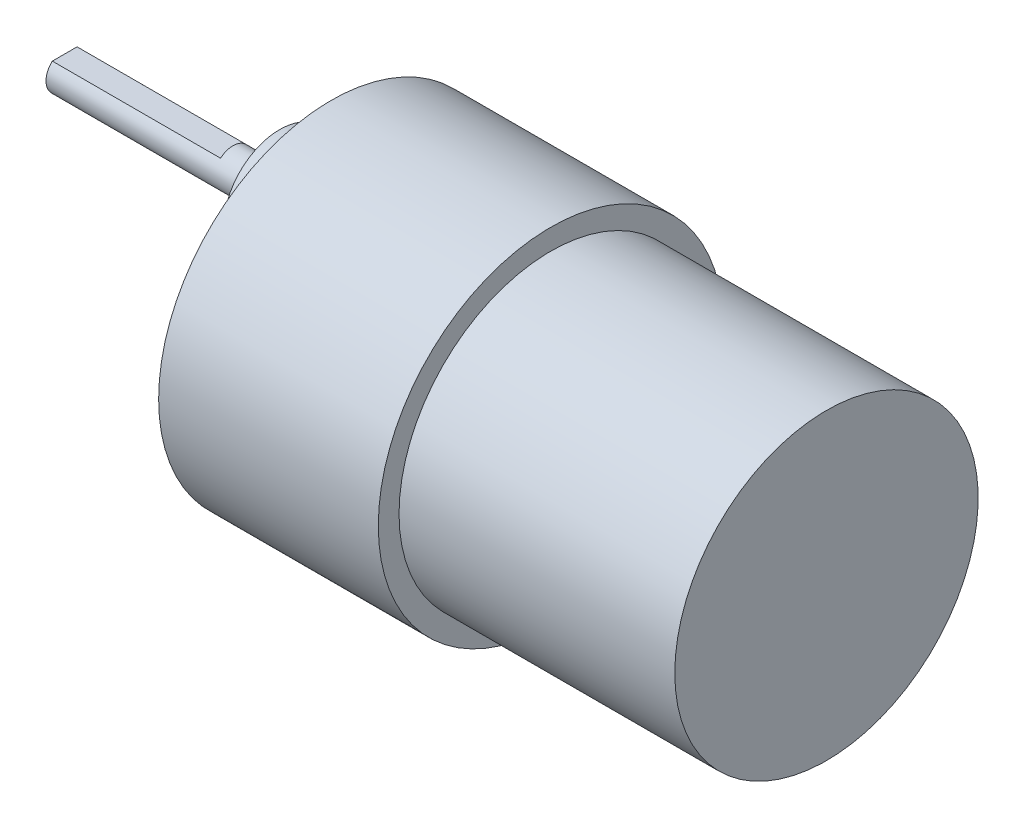
ISO-10303-21;
HEADER;
FILE_DESCRIPTION(('STEP AP214'),'2;1');
FILE_NAME('part.step','',(''),(''),'','','');
FILE_SCHEMA(('AUTOMOTIVE_DESIGN { 1 0 10303 214 1 1 1 1 }'));
ENDSEC;
DATA;
#1=APPLICATION_CONTEXT('core data for automotive mechanical design processes');
#2=APPLICATION_PROTOCOL_DEFINITION('international standard','automotive_design',2000,#1);
#3=PRODUCT_CONTEXT('',#1,'mechanical');
#4=PRODUCT('Part','Part','',(#3));
#5=PRODUCT_RELATED_PRODUCT_CATEGORY('part','',(#4));
#6=PRODUCT_DEFINITION_FORMATION('','',#4);
#7=PRODUCT_DEFINITION_CONTEXT('part definition',#1,'design');
#8=PRODUCT_DEFINITION('design','',#6,#7);
#9=PRODUCT_DEFINITION_SHAPE('','',#8);
#10=(LENGTH_UNIT() NAMED_UNIT(*) SI_UNIT(.MILLI.,.METRE.));
#11=(NAMED_UNIT(*) PLANE_ANGLE_UNIT() SI_UNIT($,.RADIAN.));
#12=(NAMED_UNIT(*) SI_UNIT($,.STERADIAN.) SOLID_ANGLE_UNIT());
#13=UNCERTAINTY_MEASURE_WITH_UNIT(LENGTH_MEASURE(1.E-05),#10,'distance_accuracy_value','');
#14=(GEOMETRIC_REPRESENTATION_CONTEXT(3) GLOBAL_UNCERTAINTY_ASSIGNED_CONTEXT((#13)) GLOBAL_UNIT_ASSIGNED_CONTEXT((#10,
#11,#12)) REPRESENTATION_CONTEXT('',''));
#15=CARTESIAN_POINT('',(0.,0.,0.));
#16=DIRECTION('',(0.,0.,1.));
#17=DIRECTION('',(1.,0.,0.));
#18=AXIS2_PLACEMENT_3D('',#15,#16,#17);
#19=CARTESIAN_POINT('',(53.,0.,0.));
#20=DIRECTION('',(1.,0.,0.));
#21=DIRECTION('',(0.,0.,-1.));
#22=AXIS2_PLACEMENT_3D('',#19,#20,#21);
#23=PLANE('',#22);
#24=CARTESIAN_POINT('',(53.,0.,0.));
#25=DIRECTION('',(-1.,0.,0.));
#26=DIRECTION('',(0.,0.,1.));
#27=AXIS2_PLACEMENT_3D('',#24,#25,#26);
#28=CIRCLE('',#27,16.23);
#29=CARTESIAN_POINT('',(53.,0.,16.23));
#30=VERTEX_POINT('',#29);
#31=EDGE_CURVE('E46',#30,#30,#28,.T.);
#32=ORIENTED_EDGE('',*,*,#31,.F.);
#33=EDGE_LOOP('',(#32));
#34=FACE_BOUND('',#33,.T.);
#35=ADVANCED_FACE('F43',(#34),#23,.T.);
#36=CARTESIAN_POINT('',(0.,0.,0.));
#37=DIRECTION('',(-1.,0.,0.));
#38=DIRECTION('',(0.,0.,1.));
#39=AXIS2_PLACEMENT_3D('',#36,#37,#38);
#40=CYLINDRICAL_SURFACE('',#39,16.23);
#41=ORIENTED_EDGE('',*,*,#31,.T.);
#42=EDGE_LOOP('',(#41));
#43=FACE_BOUND('',#42,.T.);
#44=CARTESIAN_POINT('',(23.5,0.,0.));
#45=DIRECTION('',(-1.,0.,0.));
#46=DIRECTION('',(0.,0.,1.));
#47=AXIS2_PLACEMENT_3D('',#44,#45,#46);
#48=CIRCLE('',#47,16.23);
#49=CARTESIAN_POINT('',(23.5,0.,16.23));
#50=VERTEX_POINT('',#49);
#51=EDGE_CURVE('E177',#50,#50,#48,.T.);
#52=ORIENTED_EDGE('',*,*,#51,.F.);
#53=EDGE_LOOP('',(#52));
#54=FACE_BOUND('',#53,.T.);
#55=ADVANCED_FACE('F186',(#43,#54),#40,.T.);
#56=CARTESIAN_POINT('',(23.5,0.,0.));
#57=DIRECTION('',(-1.,0.,0.));
#58=DIRECTION('',(0.,0.,1.));
#59=AXIS2_PLACEMENT_3D('',#56,#57,#58);
#60=PLANE('',#59);
#61=CARTESIAN_POINT('',(23.5,0.,0.));
#62=DIRECTION('',(-1.,0.,0.));
#63=DIRECTION('',(0.,0.,1.));
#64=AXIS2_PLACEMENT_3D('',#61,#62,#63);
#65=CIRCLE('',#64,18.45);
#66=CARTESIAN_POINT('',(23.5,0.,18.45));
#67=VERTEX_POINT('',#66);
#68=EDGE_CURVE('E174',#67,#67,#65,.T.);
#69=ORIENTED_EDGE('',*,*,#68,.F.);
#70=EDGE_LOOP('',(#69));
#71=FACE_BOUND('',#70,.T.);
#72=ORIENTED_EDGE('',*,*,#51,.T.);
#73=EDGE_LOOP('',(#72));
#74=FACE_BOUND('',#73,.T.);
#75=ADVANCED_FACE('F193',(#71,#74),#60,.F.);
#76=CARTESIAN_POINT('',(0.,0.,0.));
#77=DIRECTION('',(-1.,0.,0.));
#78=DIRECTION('',(0.,0.,1.));
#79=AXIS2_PLACEMENT_3D('',#76,#77,#78);
#80=CYLINDRICAL_SURFACE('',#79,18.45);
#81=ORIENTED_EDGE('',*,*,#68,.T.);
#82=EDGE_LOOP('',(#81));
#83=FACE_BOUND('',#82,.T.);
#84=CARTESIAN_POINT('',(0.,0.,0.));
#85=DIRECTION('',(-1.,0.,0.));
#86=DIRECTION('',(0.,0.,1.));
#87=AXIS2_PLACEMENT_3D('',#84,#85,#86);
#88=CIRCLE('',#87,18.45);
#89=CARTESIAN_POINT('',(0.,0.,18.45));
#90=VERTEX_POINT('',#89);
#91=EDGE_CURVE('E170',#90,#90,#88,.T.);
#92=ORIENTED_EDGE('',*,*,#91,.F.);
#93=EDGE_LOOP('',(#92));
#94=FACE_BOUND('',#93,.T.);
#95=ADVANCED_FACE('F197',(#83,#94),#80,.T.);
#96=CARTESIAN_POINT('',(0.,0.,0.));
#97=DIRECTION('',(-1.,0.,0.));
#98=DIRECTION('',(0.,0.,1.));
#99=AXIS2_PLACEMENT_3D('',#96,#97,#98);
#100=PLANE('',#99);
#101=CARTESIAN_POINT('',(0.,7.,0.));
#102=DIRECTION('',(-1.,0.,0.));
#103=DIRECTION('',(0.,0.,1.));
#104=AXIS2_PLACEMENT_3D('',#101,#102,#103);
#105=CIRCLE('',#104,6.);
#106=CARTESIAN_POINT('',(0.,7.,6.));
#107=VERTEX_POINT('',#106);
#108=EDGE_CURVE('E113',#107,#107,#105,.T.);
#109=ORIENTED_EDGE('',*,*,#108,.F.);
#110=EDGE_LOOP('',(#109));
#111=FACE_BOUND('',#110,.T.);
#112=CARTESIAN_POINT('',(0.,13.4233937586588,7.75000000000002));
#113=DIRECTION('',(-1.,0.,0.));
#114=DIRECTION('',(0.,0.,1.));
#115=AXIS2_PLACEMENT_3D('',#112,#113,#114);
#116=CIRCLE('',#115,1.44999999999999);
#117=CARTESIAN_POINT('',(0.,13.4233937586588,9.2));
#118=VERTEX_POINT('',#117);
#119=EDGE_CURVE('E119',#118,#118,#116,.T.);
#120=ORIENTED_EDGE('',*,*,#119,.F.);
#121=EDGE_LOOP('',(#120));
#122=FACE_BOUND('',#121,.T.);
#123=CARTESIAN_POINT('',(0.,5.52509427098613E-13,15.5000000000003));
#124=DIRECTION('',(-1.,0.,0.));
#125=DIRECTION('',(0.,0.,1.));
#126=AXIS2_PLACEMENT_3D('',#123,#124,#125);
#127=CIRCLE('',#126,1.44999999999999);
#128=CARTESIAN_POINT('',(0.,5.52509427098613E-13,16.9500000000003));
#129=VERTEX_POINT('',#128);
#130=EDGE_CURVE('E130',#129,#129,#127,.T.);
#131=ORIENTED_EDGE('',*,*,#130,.F.);
#132=EDGE_LOOP('',(#131));
#133=FACE_BOUND('',#132,.T.);
#134=CARTESIAN_POINT('',(0.,-13.4233937586582,7.75000000000097));
#135=DIRECTION('',(-1.,0.,0.));
#136=DIRECTION('',(0.,0.,1.));
#137=AXIS2_PLACEMENT_3D('',#134,#135,#136);
#138=CIRCLE('',#137,1.44999999999999);
#139=CARTESIAN_POINT('',(0.,-13.4233937586582,9.20000000000096));
#140=VERTEX_POINT('',#139);
#141=EDGE_CURVE('E138',#140,#140,#138,.T.);
#142=ORIENTED_EDGE('',*,*,#141,.F.);
#143=EDGE_LOOP('',(#142));
#144=FACE_BOUND('',#143,.T.);
#145=CARTESIAN_POINT('',(0.,-13.4233937586588,-7.7499999999987));
#146=DIRECTION('',(-1.,0.,0.));
#147=DIRECTION('',(0.,0.,1.));
#148=AXIS2_PLACEMENT_3D('',#145,#146,#147);
#149=CIRCLE('',#148,1.44999999999999);
#150=CARTESIAN_POINT('',(0.,-13.4233937586588,-6.29999999999871));
#151=VERTEX_POINT('',#150);
#152=EDGE_CURVE('E146',#151,#151,#149,.T.);
#153=ORIENTED_EDGE('',*,*,#152,.F.);
#154=EDGE_LOOP('',(#153));
#155=FACE_BOUND('',#154,.T.);
#156=CARTESIAN_POINT('',(0.,-5.57713597526543E-13,-15.499999999999));
#157=DIRECTION('',(-1.,0.,0.));
#158=DIRECTION('',(0.,0.,1.));
#159=AXIS2_PLACEMENT_3D('',#156,#157,#158);
#160=CIRCLE('',#159,1.44999999999999);
#161=CARTESIAN_POINT('',(0.,-5.57713597526543E-13,-14.049999999999));
#162=VERTEX_POINT('',#161);
#163=EDGE_CURVE('E154',#162,#162,#160,.T.);
#164=ORIENTED_EDGE('',*,*,#163,.F.);
#165=EDGE_LOOP('',(#164));
#166=FACE_BOUND('',#165,.T.);
#167=CARTESIAN_POINT('',(0.,13.4233937586582,-7.74999999999965));
#168=DIRECTION('',(-1.,0.,0.));
#169=DIRECTION('',(0.,0.,1.));
#170=AXIS2_PLACEMENT_3D('',#167,#168,#169);
#171=CIRCLE('',#170,1.44999999999999);
#172=CARTESIAN_POINT('',(0.,13.4233937586582,-6.29999999999966));
#173=VERTEX_POINT('',#172);
#174=EDGE_CURVE('E162',#173,#173,#171,.T.);
#175=ORIENTED_EDGE('',*,*,#174,.F.);
#176=EDGE_LOOP('',(#175));
#177=FACE_BOUND('',#176,.T.);
#178=ORIENTED_EDGE('',*,*,#91,.T.);
#179=EDGE_LOOP('',(#178));
#180=FACE_BOUND('',#179,.T.);
#181=ADVANCED_FACE('F203',(#111,#122,#133,#144,#155,#166,#177,#180),#100,.T.);
#182=CARTESIAN_POINT('',(3.5,13.4233937586582,-7.74999999999965));
#183=DIRECTION('',(-1.,0.,0.));
#184=DIRECTION('',(0.,0.,1.));
#185=AXIS2_PLACEMENT_3D('',#182,#183,#184);
#186=CONICAL_SURFACE('',#185,1.45,1.02974425867665);
#187=CARTESIAN_POINT('',(4.37124789758996,13.4233937586582,-7.74999999999965));
#188=VERTEX_POINT('',#187);
#189=VERTEX_LOOP('',#188);
#190=FACE_BOUND('',#189,.T.);
#191=CARTESIAN_POINT('',(3.5,13.4233937586582,-7.74999999999965));
#192=DIRECTION('',(-1.,0.,0.));
#193=DIRECTION('',(0.,0.,1.));
#194=AXIS2_PLACEMENT_3D('',#191,#192,#193);
#195=CIRCLE('',#194,1.45);
#196=CARTESIAN_POINT('',(3.5,13.4233937586582,-6.29999999999965));
#197=VERTEX_POINT('',#196);
#198=EDGE_CURVE('E166',#197,#197,#195,.T.);
#199=ORIENTED_EDGE('',*,*,#198,.T.);
#200=EDGE_LOOP('',(#199));
#201=FACE_BOUND('',#200,.T.);
#202=ADVANCED_FACE('F207',(#190,#201),#186,.F.);
#203=CARTESIAN_POINT('',(0.,13.4233937586582,-7.74999999999965));
#204=DIRECTION('',(-1.,0.,0.));
#205=DIRECTION('',(0.,0.,1.));
#206=AXIS2_PLACEMENT_3D('',#203,#204,#205);
#207=CYLINDRICAL_SURFACE('',#206,1.44999999999999);
#208=ORIENTED_EDGE('',*,*,#198,.F.);
#209=EDGE_LOOP('',(#208));
#210=FACE_BOUND('',#209,.T.);
#211=ORIENTED_EDGE('',*,*,#174,.T.);
#212=EDGE_LOOP('',(#211));
#213=FACE_BOUND('',#212,.T.);
#214=ADVANCED_FACE('F211',(#210,#213),#207,.F.);
#215=CARTESIAN_POINT('',(3.5,-5.57713597526543E-13,-15.499999999999));
#216=DIRECTION('',(-1.,0.,0.));
#217=DIRECTION('',(0.,0.,1.));
#218=AXIS2_PLACEMENT_3D('',#215,#216,#217);
#219=CONICAL_SURFACE('',#218,1.45,1.02974425867665);
#220=CARTESIAN_POINT('',(4.37124789758996,-5.58784244475756E-13,-15.499999999999));
#221=VERTEX_POINT('',#220);
#222=VERTEX_LOOP('',#221);
#223=FACE_BOUND('',#222,.T.);
#224=CARTESIAN_POINT('',(3.5,-5.57713597526543E-13,-15.499999999999));
#225=DIRECTION('',(-1.,0.,0.));
#226=DIRECTION('',(0.,0.,1.));
#227=AXIS2_PLACEMENT_3D('',#224,#225,#226);
#228=CIRCLE('',#227,1.45);
#229=CARTESIAN_POINT('',(3.5,-5.57713597526543E-13,-14.049999999999));
#230=VERTEX_POINT('',#229);
#231=EDGE_CURVE('E158',#230,#230,#228,.T.);
#232=ORIENTED_EDGE('',*,*,#231,.T.);
#233=EDGE_LOOP('',(#232));
#234=FACE_BOUND('',#233,.T.);
#235=ADVANCED_FACE('F214',(#223,#234),#219,.F.);
#236=CARTESIAN_POINT('',(0.,-5.57713597526543E-13,-15.499999999999));
#237=DIRECTION('',(-1.,0.,0.));
#238=DIRECTION('',(0.,0.,1.));
#239=AXIS2_PLACEMENT_3D('',#236,#237,#238);
#240=CYLINDRICAL_SURFACE('',#239,1.44999999999999);
#241=ORIENTED_EDGE('',*,*,#231,.F.);
#242=EDGE_LOOP('',(#241));
#243=FACE_BOUND('',#242,.T.);
#244=ORIENTED_EDGE('',*,*,#163,.T.);
#245=EDGE_LOOP('',(#244));
#246=FACE_BOUND('',#245,.T.);
#247=ADVANCED_FACE('F218',(#243,#246),#240,.F.);
#248=CARTESIAN_POINT('',(3.5,-13.4233937586588,-7.7499999999987));
#249=DIRECTION('',(-1.,0.,0.));
#250=DIRECTION('',(0.,0.,1.));
#251=AXIS2_PLACEMENT_3D('',#248,#249,#250);
#252=CONICAL_SURFACE('',#251,1.45,1.02974425867665);
#253=CARTESIAN_POINT('',(4.37124789758996,-13.4233937586588,-7.7499999999987));
#254=VERTEX_POINT('',#253);
#255=VERTEX_LOOP('',#254);
#256=FACE_BOUND('',#255,.T.);
#257=CARTESIAN_POINT('',(3.5,-13.4233937586588,-7.7499999999987));
#258=DIRECTION('',(-1.,0.,0.));
#259=DIRECTION('',(0.,0.,1.));
#260=AXIS2_PLACEMENT_3D('',#257,#258,#259);
#261=CIRCLE('',#260,1.45);
#262=CARTESIAN_POINT('',(3.5,-13.4233937586588,-6.2999999999987));
#263=VERTEX_POINT('',#262);
#264=EDGE_CURVE('E150',#263,#263,#261,.T.);
#265=ORIENTED_EDGE('',*,*,#264,.T.);
#266=EDGE_LOOP('',(#265));
#267=FACE_BOUND('',#266,.T.);
#268=ADVANCED_FACE('F222',(#256,#267),#252,.F.);
#269=CARTESIAN_POINT('',(0.,-13.4233937586588,-7.7499999999987));
#270=DIRECTION('',(-1.,0.,0.));
#271=DIRECTION('',(0.,0.,1.));
#272=AXIS2_PLACEMENT_3D('',#269,#270,#271);
#273=CYLINDRICAL_SURFACE('',#272,1.44999999999999);
#274=ORIENTED_EDGE('',*,*,#264,.F.);
#275=EDGE_LOOP('',(#274));
#276=FACE_BOUND('',#275,.T.);
#277=ORIENTED_EDGE('',*,*,#152,.T.);
#278=EDGE_LOOP('',(#277));
#279=FACE_BOUND('',#278,.T.);
#280=ADVANCED_FACE('F226',(#276,#279),#273,.F.);
#281=CARTESIAN_POINT('',(3.5,-13.4233937586582,7.75000000000097));
#282=DIRECTION('',(-1.,0.,0.));
#283=DIRECTION('',(0.,0.,1.));
#284=AXIS2_PLACEMENT_3D('',#281,#282,#283);
#285=CONICAL_SURFACE('',#284,1.45,1.02974425867665);
#286=CARTESIAN_POINT('',(4.37124789758996,-13.4233937586582,7.75000000000097));
#287=VERTEX_POINT('',#286);
#288=VERTEX_LOOP('',#287);
#289=FACE_BOUND('',#288,.T.);
#290=CARTESIAN_POINT('',(3.5,-13.4233937586582,7.75000000000097));
#291=DIRECTION('',(-1.,0.,0.));
#292=DIRECTION('',(0.,0.,1.));
#293=AXIS2_PLACEMENT_3D('',#290,#291,#292);
#294=CIRCLE('',#293,1.45);
#295=CARTESIAN_POINT('',(3.5,-13.4233937586582,9.20000000000097));
#296=VERTEX_POINT('',#295);
#297=EDGE_CURVE('E142',#296,#296,#294,.T.);
#298=ORIENTED_EDGE('',*,*,#297,.T.);
#299=EDGE_LOOP('',(#298));
#300=FACE_BOUND('',#299,.T.);
#301=ADVANCED_FACE('F230',(#289,#300),#285,.F.);
#302=CARTESIAN_POINT('',(0.,-13.4233937586582,7.75000000000097));
#303=DIRECTION('',(-1.,0.,0.));
#304=DIRECTION('',(0.,0.,1.));
#305=AXIS2_PLACEMENT_3D('',#302,#303,#304);
#306=CYLINDRICAL_SURFACE('',#305,1.44999999999999);
#307=ORIENTED_EDGE('',*,*,#297,.F.);
#308=EDGE_LOOP('',(#307));
#309=FACE_BOUND('',#308,.T.);
#310=ORIENTED_EDGE('',*,*,#141,.T.);
#311=EDGE_LOOP('',(#310));
#312=FACE_BOUND('',#311,.T.);
#313=ADVANCED_FACE('F234',(#309,#312),#306,.F.);
#314=CARTESIAN_POINT('',(3.5,5.52509427098613E-13,15.5000000000003));
#315=DIRECTION('',(-1.,0.,0.));
#316=DIRECTION('',(0.,0.,1.));
#317=AXIS2_PLACEMENT_3D('',#314,#315,#316);
#318=CONICAL_SURFACE('',#317,1.45,1.02974425867665);
#319=CARTESIAN_POINT('',(4.37124789758996,5.514387801494E-13,15.5000000000003));
#320=VERTEX_POINT('',#319);
#321=VERTEX_LOOP('',#320);
#322=FACE_BOUND('',#321,.T.);
#323=CARTESIAN_POINT('',(3.5,5.52509427098613E-13,15.5000000000003));
#324=DIRECTION('',(-1.,0.,0.));
#325=DIRECTION('',(0.,0.,1.));
#326=AXIS2_PLACEMENT_3D('',#323,#324,#325);
#327=CIRCLE('',#326,1.45);
#328=CARTESIAN_POINT('',(3.5,5.52509427098613E-13,16.9500000000003));
#329=VERTEX_POINT('',#328);
#330=EDGE_CURVE('E134',#329,#329,#327,.T.);
#331=ORIENTED_EDGE('',*,*,#330,.T.);
#332=EDGE_LOOP('',(#331));
#333=FACE_BOUND('',#332,.T.);
#334=ADVANCED_FACE('F238',(#322,#333),#318,.F.);
#335=CARTESIAN_POINT('',(0.,5.52509427098613E-13,15.5000000000003));
#336=DIRECTION('',(-1.,0.,0.));
#337=DIRECTION('',(0.,0.,1.));
#338=AXIS2_PLACEMENT_3D('',#335,#336,#337);
#339=CYLINDRICAL_SURFACE('',#338,1.44999999999999);
#340=ORIENTED_EDGE('',*,*,#330,.F.);
#341=EDGE_LOOP('',(#340));
#342=FACE_BOUND('',#341,.T.);
#343=ORIENTED_EDGE('',*,*,#130,.T.);
#344=EDGE_LOOP('',(#343));
#345=FACE_BOUND('',#344,.T.);
#346=ADVANCED_FACE('F242',(#342,#345),#339,.F.);
#347=CARTESIAN_POINT('',(3.5,13.4233937586588,7.75000000000002));
#348=DIRECTION('',(-1.,0.,0.));
#349=DIRECTION('',(0.,0.,1.));
#350=AXIS2_PLACEMENT_3D('',#347,#348,#349);
#351=CONICAL_SURFACE('',#350,1.45,1.02974425867665);
#352=CARTESIAN_POINT('',(4.37124789758996,13.4233937586588,7.75000000000002));
#353=VERTEX_POINT('',#352);
#354=VERTEX_LOOP('',#353);
#355=FACE_BOUND('',#354,.T.);
#356=CARTESIAN_POINT('',(3.5,13.4233937586588,7.75000000000002));
#357=DIRECTION('',(-1.,0.,0.));
#358=DIRECTION('',(0.,0.,1.));
#359=AXIS2_PLACEMENT_3D('',#356,#357,#358);
#360=CIRCLE('',#359,1.45);
#361=CARTESIAN_POINT('',(3.5,13.4233937586588,9.20000000000001));
#362=VERTEX_POINT('',#361);
#363=EDGE_CURVE('E126',#362,#362,#360,.T.);
#364=ORIENTED_EDGE('',*,*,#363,.T.);
#365=EDGE_LOOP('',(#364));
#366=FACE_BOUND('',#365,.T.);
#367=ADVANCED_FACE('F246',(#355,#366),#351,.F.);
#368=CARTESIAN_POINT('',(0.,13.4233937586588,7.75000000000002));
#369=DIRECTION('',(-1.,0.,0.));
#370=DIRECTION('',(0.,0.,1.));
#371=AXIS2_PLACEMENT_3D('',#368,#369,#370);
#372=CYLINDRICAL_SURFACE('',#371,1.44999999999999);
#373=ORIENTED_EDGE('',*,*,#363,.F.);
#374=EDGE_LOOP('',(#373));
#375=FACE_BOUND('',#374,.T.);
#376=ORIENTED_EDGE('',*,*,#119,.T.);
#377=EDGE_LOOP('',(#376));
#378=FACE_BOUND('',#377,.T.);
#379=ADVANCED_FACE('F250',(#375,#378),#372,.F.);
#380=CARTESIAN_POINT('',(-5.5,7.,0.));
#381=DIRECTION('',(1.,0.,0.));
#382=DIRECTION('',(0.,0.,-1.));
#383=AXIS2_PLACEMENT_3D('',#380,#381,#382);
#384=CYLINDRICAL_SURFACE('',#383,6.);
#385=CARTESIAN_POINT('',(-5.5,7.,0.));
#386=DIRECTION('',(-1.,0.,0.));
#387=DIRECTION('',(0.,0.,1.));
#388=AXIS2_PLACEMENT_3D('',#385,#386,#387);
#389=CIRCLE('',#388,6.);
#390=CARTESIAN_POINT('',(-5.5,7.,6.));
#391=VERTEX_POINT('',#390);
#392=EDGE_CURVE('E115',#391,#391,#389,.T.);
#393=ORIENTED_EDGE('',*,*,#392,.F.);
#394=EDGE_LOOP('',(#393));
#395=FACE_BOUND('',#394,.T.);
#396=ORIENTED_EDGE('',*,*,#108,.T.);
#397=EDGE_LOOP('',(#396));
#398=FACE_BOUND('',#397,.T.);
#399=ADVANCED_FACE('F254',(#395,#398),#384,.T.);
#400=CARTESIAN_POINT('',(-5.5,7.,0.));
#401=DIRECTION('',(-1.,0.,0.));
#402=DIRECTION('',(0.,0.,1.));
#403=AXIS2_PLACEMENT_3D('',#400,#401,#402);
#404=PLANE('',#403);
#405=CARTESIAN_POINT('',(-5.5,7.,0.));
#406=DIRECTION('',(-1.,0.,0.));
#407=DIRECTION('',(0.,0.,1.));
#408=AXIS2_PLACEMENT_3D('',#405,#406,#407);
#409=CIRCLE('',#408,2.);
#410=CARTESIAN_POINT('',(-5.5,7.,2.));
#411=VERTEX_POINT('',#410);
#412=EDGE_CURVE('E11',#411,#411,#409,.T.);
#413=ORIENTED_EDGE('',*,*,#412,.F.);
#414=EDGE_LOOP('',(#413));
#415=FACE_BOUND('',#414,.T.);
#416=ORIENTED_EDGE('',*,*,#392,.T.);
#417=EDGE_LOOP('',(#416));
#418=FACE_BOUND('',#417,.T.);
#419=ADVANCED_FACE('F258',(#415,#418),#404,.T.);
#420=CARTESIAN_POINT('',(-28.5,7.,0.));
#421=DIRECTION('',(1.,0.,0.));
#422=DIRECTION('',(0.,0.,-1.));
#423=AXIS2_PLACEMENT_3D('',#420,#421,#422);
#424=CYLINDRICAL_SURFACE('',#423,2.);
#425=CARTESIAN_POINT('',(-28.5,7.,0.));
#426=DIRECTION('',(-1.,0.,0.));
#427=DIRECTION('',(0.,0.,1.));
#428=AXIS2_PLACEMENT_3D('',#425,#426,#427);
#429=CIRCLE('',#428,2.);
#430=CARTESIAN_POINT('',(-28.5,8.5,-1.32287565553229));
#431=VERTEX_POINT('',#430);
#432=CARTESIAN_POINT('',(-28.5,8.5,1.32287565553229));
#433=VERTEX_POINT('',#432);
#434=EDGE_CURVE('E105',#431,#433,#429,.T.);
#435=ORIENTED_EDGE('',*,*,#434,.F.);
#436=DIRECTION('',(-1.,0.,0.));
#437=VECTOR('',#436,1.);
#438=CARTESIAN_POINT('',(-10.5,8.5,-1.32287565553229));
#439=LINE('',#438,#437);
#440=CARTESIAN_POINT('',(-10.5,8.5,-1.32287565553229));
#441=VERTEX_POINT('',#440);
#442=EDGE_CURVE('E59',#441,#431,#439,.T.);
#443=ORIENTED_EDGE('',*,*,#442,.F.);
#444=CARTESIAN_POINT('',(-10.5,7.,0.));
#445=DIRECTION('',(-1.,0.,0.));
#446=DIRECTION('',(0.,0.,1.));
#447=AXIS2_PLACEMENT_3D('',#444,#445,#446);
#448=CIRCLE('',#447,2.);
#449=CARTESIAN_POINT('',(-10.5,8.5,1.32287565553229));
#450=VERTEX_POINT('',#449);
#451=EDGE_CURVE('E89',#450,#441,#448,.T.);
#452=ORIENTED_EDGE('',*,*,#451,.F.);
#453=DIRECTION('',(-1.,0.,0.));
#454=VECTOR('',#453,1.);
#455=CARTESIAN_POINT('',(-10.5,8.5,1.32287565553229));
#456=LINE('',#455,#454);
#457=EDGE_CURVE('E98',#450,#433,#456,.T.);
#458=ORIENTED_EDGE('',*,*,#457,.T.);
#459=EDGE_LOOP('',(#435,#443,#452,#458));
#460=FACE_BOUND('',#459,.T.);
#461=ORIENTED_EDGE('',*,*,#412,.T.);
#462=EDGE_LOOP('',(#461));
#463=FACE_BOUND('',#462,.T.);
#464=ADVANCED_FACE('F102',(#460,#463),#424,.T.);
#465=CARTESIAN_POINT('',(-28.5,7.,0.));
#466=DIRECTION('',(-1.,0.,0.));
#467=DIRECTION('',(0.,0.,1.));
#468=AXIS2_PLACEMENT_3D('',#465,#466,#467);
#469=PLANE('',#468);
#470=DIRECTION('',(0.,0.,1.));
#471=VECTOR('',#470,1.);
#472=CARTESIAN_POINT('',(-28.5,8.5,0.));
#473=LINE('',#472,#471);
#474=EDGE_CURVE('E95',#431,#433,#473,.T.);
#475=ORIENTED_EDGE('',*,*,#474,.F.);
#476=ORIENTED_EDGE('',*,*,#434,.T.);
#477=EDGE_LOOP('',(#475,#476));
#478=FACE_BOUND('',#477,.T.);
#479=ADVANCED_FACE('F265',(#478),#469,.T.);
#480=CARTESIAN_POINT('',(-10.5,8.5,0.));
#481=DIRECTION('',(0.,-1.,0.));
#482=DIRECTION('',(0.,0.,-1.));
#483=AXIS2_PLACEMENT_3D('',#480,#481,#482);
#484=PLANE('',#483);
#485=ORIENTED_EDGE('',*,*,#474,.T.);
#486=ORIENTED_EDGE('',*,*,#457,.F.);
#487=DIRECTION('',(0.,0.,1.));
#488=VECTOR('',#487,1.);
#489=CARTESIAN_POINT('',(-10.5,8.5,0.));
#490=LINE('',#489,#488);
#491=EDGE_CURVE('E91',#441,#450,#490,.T.);
#492=ORIENTED_EDGE('',*,*,#491,.F.);
#493=ORIENTED_EDGE('',*,*,#442,.T.);
#494=EDGE_LOOP('',(#485,#486,#492,#493));
#495=FACE_BOUND('',#494,.T.);
#496=ADVANCED_FACE('F97',(#495),#484,.F.);
#497=CARTESIAN_POINT('',(-10.5,0.,0.));
#498=DIRECTION('',(-1.,0.,0.));
#499=DIRECTION('',(0.,0.,1.));
#500=AXIS2_PLACEMENT_3D('',#497,#498,#499);
#501=PLANE('',#500);
#502=ORIENTED_EDGE('',*,*,#451,.T.);
#503=ORIENTED_EDGE('',*,*,#491,.T.);
#504=EDGE_LOOP('',(#502,#503));
#505=FACE_BOUND('',#504,.T.);
#506=ADVANCED_FACE('F90',(#505),#501,.T.);
#507=CLOSED_SHELL('',(#35,#55,#75,#95,#181,#202,#214,#235,#247,#268,#280,#301,#313,#334,#346,
#367,#379,#399,#419,#464,#479,#496,#506));
#508=MANIFOLD_SOLID_BREP('B2',#507);
#509=ADVANCED_BREP_SHAPE_REPRESENTATION('',(#18,#508),#14);
#510=SHAPE_DEFINITION_REPRESENTATION(#9,#509);
ENDSEC;
END-ISO-10303-21;
